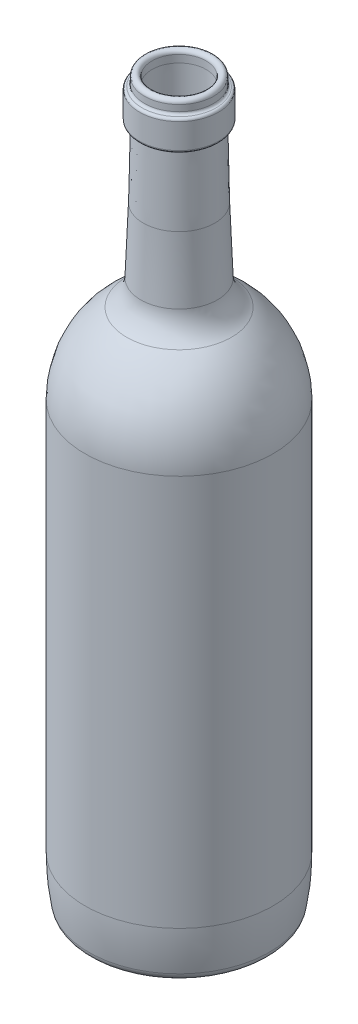
ISO-10303-21;
HEADER;
FILE_DESCRIPTION(('STEP AP214'),'2;1');
FILE_NAME('part.step','',(''),(''),'','','');
FILE_SCHEMA(('AUTOMOTIVE_DESIGN { 1 0 10303 214 1 1 1 1 }'));
ENDSEC;
DATA;
#1=APPLICATION_CONTEXT('core data for automotive mechanical design processes');
#2=APPLICATION_PROTOCOL_DEFINITION('international standard','automotive_design',2000,#1);
#3=PRODUCT_CONTEXT('',#1,'mechanical');
#4=PRODUCT('Part','Part','',(#3));
#5=PRODUCT_RELATED_PRODUCT_CATEGORY('part','',(#4));
#6=PRODUCT_DEFINITION_FORMATION('','',#4);
#7=PRODUCT_DEFINITION_CONTEXT('part definition',#1,'design');
#8=PRODUCT_DEFINITION('design','',#6,#7);
#9=PRODUCT_DEFINITION_SHAPE('','',#8);
#10=(LENGTH_UNIT() NAMED_UNIT(*) SI_UNIT(.MILLI.,.METRE.));
#11=(NAMED_UNIT(*) PLANE_ANGLE_UNIT() SI_UNIT($,.RADIAN.));
#12=(NAMED_UNIT(*) SI_UNIT($,.STERADIAN.) SOLID_ANGLE_UNIT());
#13=UNCERTAINTY_MEASURE_WITH_UNIT(LENGTH_MEASURE(1.E-05),#10,'distance_accuracy_value','');
#14=(GEOMETRIC_REPRESENTATION_CONTEXT(3) GLOBAL_UNCERTAINTY_ASSIGNED_CONTEXT((#13)) GLOBAL_UNIT_ASSIGNED_CONTEXT((#10,
#11,#12)) REPRESENTATION_CONTEXT('',''));
#15=CARTESIAN_POINT('',(0.,0.,0.));
#16=DIRECTION('',(0.,0.,1.));
#17=DIRECTION('',(1.,0.,0.));
#18=AXIS2_PLACEMENT_3D('',#15,#16,#17);
#19=CARTESIAN_POINT('',(0.,-22.,0.));
#20=DIRECTION('',(0.,-1.,0.));
#21=DIRECTION('',(-1.,0.,0.));
#22=AXIS2_PLACEMENT_3D('',#19,#20,#21);
#23=SPHERICAL_SURFACE('',#22,30.);
#24=CARTESIAN_POINT('',(0.,6.77725143150231,0.));
#25=DIRECTION('',(0.,-1.,0.));
#26=DIRECTION('',(0.,0.,-1.));
#27=AXIS2_PLACEMENT_3D('',#24,#25,#26);
#28=CIRCLE('',#27,8.47760579692748);
#29=CARTESIAN_POINT('',(0.,6.77725143150231,-8.47760579692747));
#30=VERTEX_POINT('',#29);
#31=EDGE_CURVE('E10',#30,#30,#28,.T.);
#32=ORIENTED_EDGE('',*,*,#31,.T.);
#33=EDGE_LOOP('',(#32));
#34=FACE_BOUND('',#33,.T.);
#35=ADVANCED_FACE('F30',(#34),#23,.F.);
#36=CARTESIAN_POINT('',(0.,0.163033142466357,0.));
#37=DIRECTION('',(0.,-1.,0.));
#38=DIRECTION('',(0.,0.,-1.));
#39=AXIS2_PLACEMENT_3D('',#36,#37,#38);
#40=CONICAL_SURFACE('',#39,30.9295842547384,1.28430650884736);
#41=CARTESIAN_POINT('',(0.,0.163033142466357,0.));
#42=DIRECTION('',(0.,-1.,0.));
#43=DIRECTION('',(0.,0.,-1.));
#44=AXIS2_PLACEMENT_3D('',#41,#42,#43);
#45=CIRCLE('',#44,30.9295842547384);
#46=CARTESIAN_POINT('',(0.,0.163033142466357,-30.9295842547384));
#47=VERTEX_POINT('',#46);
#48=EDGE_CURVE('E36',#47,#47,#45,.T.);
#49=CARTESIAN_POINT('',(0.,6.77725143150231,-8.47760579692747));
#50=CARTESIAN_POINT('',(0.,6.70835332432485,-8.71148057252967));
#51=CARTESIAN_POINT('',(0.,6.6394552171474,-8.94535534813187));
#52=CARTESIAN_POINT('',(0.,6.50165900279248,-9.41310489933626));
#53=CARTESIAN_POINT('',(0.,6.43276089561502,-9.64697967493846));
#54=CARTESIAN_POINT('',(0.,6.29496468126011,-10.1147292261429));
#55=CARTESIAN_POINT('',(0.,6.22606657408265,-10.348604001745));
#56=CARTESIAN_POINT('',(0.,6.08827035972773,-10.8163535529494));
#57=CARTESIAN_POINT('',(0.,6.01937225255028,-11.0502283285516));
#58=CARTESIAN_POINT('',(0.,5.88157603819536,-11.517977879756));
#59=CARTESIAN_POINT('',(0.,5.8126779310179,-11.7518526553582));
#60=CARTESIAN_POINT('',(0.,5.67488171666299,-12.2196022065626));
#61=CARTESIAN_POINT('',(0.,5.60598360948553,-12.4534769821648));
#62=CARTESIAN_POINT('',(0.,5.46818739513061,-12.9212265333692));
#63=CARTESIAN_POINT('',(0.,5.39928928795315,-13.1551013089714));
#64=CARTESIAN_POINT('',(0.,5.26149307359824,-13.6228508601758));
#65=CARTESIAN_POINT('',(0.,5.19259496642078,-13.856725635778));
#66=CARTESIAN_POINT('',(0.,5.05479875206587,-14.3244751869824));
#67=CARTESIAN_POINT('',(0.,4.98590064488841,-14.5583499625846));
#68=CARTESIAN_POINT('',(0.,4.84810443053349,-15.026099513789));
#69=CARTESIAN_POINT('',(0.,4.77920632335603,-15.2599742893912));
#70=CARTESIAN_POINT('',(0.,4.64141010900112,-15.7277238405956));
#71=CARTESIAN_POINT('',(0.,4.57251200182366,-15.9615986161978));
#72=CARTESIAN_POINT('',(0.,4.43471578746875,-16.4293481674022));
#73=CARTESIAN_POINT('',(0.,4.36581768029129,-16.6632229430044));
#74=CARTESIAN_POINT('',(0.,4.22802146593637,-17.1309724942088));
#75=CARTESIAN_POINT('',(0.,4.15912335875891,-17.364847269811));
#76=CARTESIAN_POINT('',(0.,4.021327144404,-17.8325968210153));
#77=CARTESIAN_POINT('',(0.,3.95242903722654,-18.0664715966175));
#78=CARTESIAN_POINT('',(0.,3.81463282287162,-18.5342211478219));
#79=CARTESIAN_POINT('',(0.,3.74573471569417,-18.7680959234241));
#80=CARTESIAN_POINT('',(0.,3.60793850133925,-19.2358454746285));
#81=CARTESIAN_POINT('',(0.,3.53904039416179,-19.4697202502307));
#82=CARTESIAN_POINT('',(0.,3.40124417980688,-19.9374698014351));
#83=CARTESIAN_POINT('',(0.,3.33234607262942,-20.1713445770373));
#84=CARTESIAN_POINT('',(0.,3.1945498582745,-20.6390941282417));
#85=CARTESIAN_POINT('',(0.,3.12565175109705,-20.8729689038439));
#86=CARTESIAN_POINT('',(0.,2.98785553674213,-21.3407184550483));
#87=CARTESIAN_POINT('',(0.,2.91895742956467,-21.5745932306505));
#88=CARTESIAN_POINT('',(0.,2.78116121520976,-22.0423427818549));
#89=CARTESIAN_POINT('',(0.,2.7122631080323,-22.2762175574571));
#90=CARTESIAN_POINT('',(0.,2.57446689367738,-22.7439671086615));
#91=CARTESIAN_POINT('',(0.,2.50556878649992,-22.9778418842637));
#92=CARTESIAN_POINT('',(0.,2.36777257214501,-23.4455914354681));
#93=CARTESIAN_POINT('',(0.,2.29887446496755,-23.6794662110703));
#94=CARTESIAN_POINT('',(0.,2.16107825061263,-24.1472157622747));
#95=CARTESIAN_POINT('',(0.,2.09218014343518,-24.3810905378769));
#96=CARTESIAN_POINT('',(0.,1.95438392908026,-24.8488400890812));
#97=CARTESIAN_POINT('',(0.,1.8854858219028,-25.0827148646834));
#98=CARTESIAN_POINT('',(0.,1.74768960754789,-25.5504644158878));
#99=CARTESIAN_POINT('',(0.,1.67879150037043,-25.78433919149));
#100=CARTESIAN_POINT('',(0.,1.54099528601551,-26.2520887426944));
#101=CARTESIAN_POINT('',(0.,1.47209717883806,-26.4859635182966));
#102=CARTESIAN_POINT('',(0.,1.33430096448314,-26.953713069501));
#103=CARTESIAN_POINT('',(0.,1.26540285730568,-27.1875878451032));
#104=CARTESIAN_POINT('',(0.,1.12760664295077,-27.6553373963076));
#105=CARTESIAN_POINT('',(0.,1.05870853577331,-27.8892121719098));
#106=CARTESIAN_POINT('',(0.,0.920912321418394,-28.3569617231142));
#107=CARTESIAN_POINT('',(0.,0.852014214240936,-28.5908364987164));
#108=CARTESIAN_POINT('',(0.,0.71421799988602,-29.0585860499208));
#109=CARTESIAN_POINT('',(0.,0.645319892708562,-29.292460825523));
#110=CARTESIAN_POINT('',(0.,0.507523678353646,-29.7602103767274));
#111=CARTESIAN_POINT('',(0.,0.438625571176189,-29.9940851523296));
#112=CARTESIAN_POINT('',(0.,0.300829356821273,-30.461834703534));
#113=CARTESIAN_POINT('',(0.,0.231931249643816,-30.6957094791362));
#114=CARTESIAN_POINT('',(0.,0.163033142466357,-30.9295842547384));
#115=B_SPLINE_CURVE_WITH_KNOTS('',3,(#49,#50,#51,#52,#53,#54,#55,#56,#57,#58,#59,#60,#61,#62,
#63,#64,#65,#66,#67,#68,#69,#70,#71,#72,#73,#74,#75,#76,#77,#78,#79,#80,#81,#82,#83,#84,#85,#86,
#87,#88,#89,#90,#91,#92,#93,#94,#95,#96,#97,#98,#99,#100,#101,#102,#103,#104,#105,#106,#107,
#108,#109,#110,#111,#112,#113,#114),.UNSPECIFIED.,.F.,.F.,(4,2,2,2,2,2,2,2,2,2,2,2,2,2,2,2,2,2,
2,2,2,2,2,2,2,2,2,2,2,2,2,2,4),(0.,0.731436421379558,1.46287284275911,2.19430926413866,
2.92574568551822,3.65718210689777,4.38861852827733,5.12005494965688,5.85149137103643,
6.58292779241599,7.31436421379554,8.0458006351751,8.77723705655465,9.50867347793421,
10.2401098993138,10.9715463206933,11.7029827420729,12.4344191634524,13.165855584832,
13.8972920062115,14.6287284275911,15.3601648489706,16.0916012703502,16.8230376917298,
17.5544741131093,18.2859105344889,19.0173469558684,19.748783377248,20.4802197986275,
21.2116562200071,21.9430926413866,22.6745290627662,23.4059654841457),.UNSPECIFIED.);
#116=EDGE_CURVE('BSEAM128',#30,#47,#115,.T.);
#117=ORIENTED_EDGE('',*,*,#31,.F.);
#118=ORIENTED_EDGE('',*,*,#48,.T.);
#119=ORIENTED_EDGE('',*,*,#116,.T.);
#120=ORIENTED_EDGE('',*,*,#116,.F.);
#121=EDGE_LOOP('',(#117,#119,#118,#120));
#122=FACE_BOUND('',#121,.T.);
#123=ADVANCED_FACE('F128',(#122),#40,.F.);
#124=CARTESIAN_POINT('',(0.,4.,0.));
#125=DIRECTION('',(0.,-1.,0.));
#126=DIRECTION('',(0.,0.,-1.));
#127=AXIS2_PLACEMENT_3D('',#124,#125,#126);
#128=TOROIDAL_SURFACE('',#127,32.0599316943287,4.);
#129=ORIENTED_EDGE('',*,*,#48,.F.);
#130=EDGE_LOOP('',(#129));
#131=FACE_BOUND('',#130,.T.);
#132=CARTESIAN_POINT('',(0.,3.31017266896382,0.));
#133=DIRECTION('',(0.,-1.,0.));
#134=DIRECTION('',(0.,0.,-1.));
#135=AXIS2_PLACEMENT_3D('',#132,#133,#134);
#136=CIRCLE('',#135,36.);
#137=CARTESIAN_POINT('',(0.,3.31017266896382,-36.));
#138=VERTEX_POINT('',#137);
#139=EDGE_CURVE('E40',#138,#138,#136,.T.);
#140=ORIENTED_EDGE('',*,*,#139,.T.);
#141=EDGE_LOOP('',(#140));
#142=FACE_BOUND('',#141,.T.);
#143=ADVANCED_FACE('F132',(#131,#142),#128,.T.);
#144=CARTESIAN_POINT('',(0.,20.,0.));
#145=DIRECTION('',(0.,-1.,0.));
#146=DIRECTION('',(0.,0.,-1.));
#147=AXIS2_PLACEMENT_3D('',#144,#145,#146);
#148=DEGENERATE_TOROIDAL_SURFACE('',#147,59.3268401171732,96.7768401171732,.F.);
#149=ORIENTED_EDGE('',*,*,#139,.F.);
#150=EDGE_LOOP('',(#149));
#151=FACE_BOUND('',#150,.T.);
#152=CARTESIAN_POINT('',(0.,20.,0.));
#153=DIRECTION('',(0.,-1.,0.));
#154=DIRECTION('',(0.,0.,-1.));
#155=AXIS2_PLACEMENT_3D('',#152,#153,#154);
#156=CIRCLE('',#155,37.45);
#157=CARTESIAN_POINT('',(0.,20.,-37.45));
#158=VERTEX_POINT('',#157);
#159=EDGE_CURVE('E44',#158,#158,#156,.T.);
#160=ORIENTED_EDGE('',*,*,#159,.T.);
#161=EDGE_LOOP('',(#160));
#162=FACE_BOUND('',#161,.T.);
#163=ADVANCED_FACE('F137',(#151,#162),#148,.F.);
#164=CARTESIAN_POINT('',(0.,0.,0.));
#165=DIRECTION('',(0.,-1.,0.));
#166=DIRECTION('',(0.,0.,-1.));
#167=AXIS2_PLACEMENT_3D('',#164,#165,#166);
#168=CYLINDRICAL_SURFACE('',#167,37.45);
#169=ORIENTED_EDGE('',*,*,#159,.F.);
#170=EDGE_LOOP('',(#169));
#171=FACE_BOUND('',#170,.T.);
#172=CARTESIAN_POINT('',(0.,176.,0.));
#173=DIRECTION('',(0.,-1.,0.));
#174=DIRECTION('',(0.,0.,-1.));
#175=AXIS2_PLACEMENT_3D('',#172,#173,#174);
#176=CIRCLE('',#175,37.45);
#177=CARTESIAN_POINT('',(0.,176.,-37.45));
#178=VERTEX_POINT('',#177);
#179=EDGE_CURVE('E49',#178,#178,#176,.T.);
#180=ORIENTED_EDGE('',*,*,#179,.T.);
#181=EDGE_LOOP('',(#180));
#182=FACE_BOUND('',#181,.T.);
#183=ADVANCED_FACE('F143',(#171,#182),#168,.T.);
#184=CARTESIAN_POINT('',(0.,176.,0.));
#185=DIRECTION('',(0.,-1.,0.));
#186=DIRECTION('',(0.,0.,-1.));
#187=AXIS2_PLACEMENT_3D('',#184,#185,#186);
#188=DEGENERATE_TOROIDAL_SURFACE('',#187,1.55,39.,.F.);
#189=ORIENTED_EDGE('',*,*,#179,.F.);
#190=EDGE_LOOP('',(#189));
#191=FACE_BOUND('',#190,.T.);
#192=CARTESIAN_POINT('',(0.,207.910311998831,0.));
#193=DIRECTION('',(0.,-1.,0.));
#194=DIRECTION('',(0.,0.,-1.));
#195=AXIS2_PLACEMENT_3D('',#192,#193,#194);
#196=CIRCLE('',#195,20.8716856667212);
#197=CARTESIAN_POINT('',(0.,207.910311998831,-20.8716856667212));
#198=VERTEX_POINT('',#197);
#199=EDGE_CURVE('E52',#198,#198,#196,.T.);
#200=ORIENTED_EDGE('',*,*,#199,.T.);
#201=EDGE_LOOP('',(#200));
#202=FACE_BOUND('',#201,.T.);
#203=ADVANCED_FACE('F147',(#191,#202),#188,.F.);
#204=CARTESIAN_POINT('',(0.,218.774583303086,0.));
#205=DIRECTION('',(0.,-1.,0.));
#206=DIRECTION('',(0.,0.,-1.));
#207=AXIS2_PLACEMENT_3D('',#204,#205,#206);
#208=TOROIDAL_SURFACE('',#207,28.5054335345272,13.2780456951197);
#209=ORIENTED_EDGE('',*,*,#199,.F.);
#210=EDGE_LOOP('',(#209));
#211=FACE_BOUND('',#210,.T.);
#212=CARTESIAN_POINT('',(0.,218.,0.));
#213=DIRECTION('',(0.,-1.,0.));
#214=DIRECTION('',(0.,0.,-1.));
#215=AXIS2_PLACEMENT_3D('',#212,#213,#214);
#216=CIRCLE('',#215,15.25);
#217=CARTESIAN_POINT('',(0.,218.,-15.25));
#218=VERTEX_POINT('',#217);
#219=EDGE_CURVE('E55',#218,#218,#216,.T.);
#220=ORIENTED_EDGE('',*,*,#219,.T.);
#221=EDGE_LOOP('',(#220));
#222=FACE_BOUND('',#221,.T.);
#223=ADVANCED_FACE('F151',(#211,#222),#208,.F.);
#224=CARTESIAN_POINT('',(0.,256.089285714286,0.));
#225=DIRECTION('',(0.,-1.,0.));
#226=DIRECTION('',(0.,0.,-1.));
#227=AXIS2_PLACEMENT_3D('',#224,#225,#226);
#228=TOROIDAL_SURFACE('',#227,667.07142857143,652.933356806899);
#229=ORIENTED_EDGE('',*,*,#219,.F.);
#230=EDGE_LOOP('',(#229));
#231=FACE_BOUND('',#230,.T.);
#232=CARTESIAN_POINT('',(0.,244.,0.));
#233=DIRECTION('',(0.,-1.,0.));
#234=DIRECTION('',(0.,0.,-1.));
#235=AXIS2_PLACEMENT_3D('',#232,#233,#234);
#236=CIRCLE('',#235,14.25);
#237=CARTESIAN_POINT('',(0.,244.,-14.25));
#238=VERTEX_POINT('',#237);
#239=EDGE_CURVE('E58',#238,#238,#236,.T.);
#240=ORIENTED_EDGE('',*,*,#239,.T.);
#241=EDGE_LOOP('',(#240));
#242=FACE_BOUND('',#241,.T.);
#243=ADVANCED_FACE('F155',(#231,#242),#228,.F.);
#244=CARTESIAN_POINT('',(0.,271.,0.));
#245=DIRECTION('',(0.,-1.,0.));
#246=DIRECTION('',(0.,0.,-1.));
#247=AXIS2_PLACEMENT_3D('',#244,#245,#246);
#248=CONICAL_SURFACE('',#247,13.75,0.0185164020680084);
#249=ORIENTED_EDGE('',*,*,#239,.F.);
#250=EDGE_LOOP('',(#249));
#251=FACE_BOUND('',#250,.T.);
#252=CARTESIAN_POINT('',(0.,271.,0.));
#253=DIRECTION('',(0.,-1.,0.));
#254=DIRECTION('',(0.,0.,-1.));
#255=AXIS2_PLACEMENT_3D('',#252,#253,#254);
#256=CIRCLE('',#255,13.75);
#257=CARTESIAN_POINT('',(0.,271.,-13.75));
#258=VERTEX_POINT('',#257);
#259=EDGE_CURVE('E61',#258,#258,#256,.T.);
#260=ORIENTED_EDGE('',*,*,#259,.T.);
#261=EDGE_LOOP('',(#260));
#262=FACE_BOUND('',#261,.T.);
#263=ADVANCED_FACE('F159',(#251,#262),#248,.T.);
#264=CARTESIAN_POINT('',(0.,271.018515344006,0.));
#265=DIRECTION('',(0.,-1.,0.));
#266=DIRECTION('',(0.,0.,-1.));
#267=AXIS2_PLACEMENT_3D('',#264,#265,#266);
#268=TOROIDAL_SURFACE('',#267,14.7498285763251,1.00000000000001);
#269=ORIENTED_EDGE('',*,*,#259,.F.);
#270=EDGE_LOOP('',(#269));
#271=FACE_BOUND('',#270,.T.);
#272=CARTESIAN_POINT('',(0.,272.018515329313,0.));
#273=DIRECTION('',(0.,-1.,0.));
#274=DIRECTION('',(0.,0.,-1.));
#275=AXIS2_PLACEMENT_3D('',#272,#273,#274);
#276=CIRCLE('',#275,14.75);
#277=CARTESIAN_POINT('',(0.,272.018515329313,-14.75));
#278=VERTEX_POINT('',#277);
#279=EDGE_CURVE('E64',#278,#278,#276,.T.);
#280=ORIENTED_EDGE('',*,*,#279,.T.);
#281=EDGE_LOOP('',(#280));
#282=FACE_BOUND('',#281,.T.);
#283=ADVANCED_FACE('F163',(#271,#282),#268,.F.);
#284=CARTESIAN_POINT('',(0.,273.018343920329,0.));
#285=DIRECTION('',(0.,-1.,0.));
#286=DIRECTION('',(0.,0.,-1.));
#287=AXIS2_PLACEMENT_3D('',#284,#285,#286);
#288=TOROIDAL_SURFACE('',#287,14.7501713942938,0.999828605706198);
#289=ORIENTED_EDGE('',*,*,#279,.F.);
#290=EDGE_LOOP('',(#289));
#291=FACE_BOUND('',#290,.T.);
#292=CARTESIAN_POINT('',(0.,273.018343920329,0.));
#293=DIRECTION('',(0.,-1.,0.));
#294=DIRECTION('',(0.,0.,-1.));
#295=AXIS2_PLACEMENT_3D('',#292,#293,#294);
#296=CIRCLE('',#295,15.75);
#297=CARTESIAN_POINT('',(0.,273.018343920329,-15.75));
#298=VERTEX_POINT('',#297);
#299=EDGE_CURVE('E67',#298,#298,#296,.T.);
#300=ORIENTED_EDGE('',*,*,#299,.T.);
#301=EDGE_LOOP('',(#300));
#302=FACE_BOUND('',#301,.T.);
#303=ADVANCED_FACE('F167',(#291,#302),#288,.T.);
#304=CARTESIAN_POINT('',(0.,0.,0.));
#305=DIRECTION('',(0.,-1.,0.));
#306=DIRECTION('',(0.,0.,-1.));
#307=AXIS2_PLACEMENT_3D('',#304,#305,#306);
#308=CYLINDRICAL_SURFACE('',#307,15.75);
#309=ORIENTED_EDGE('',*,*,#299,.F.);
#310=EDGE_LOOP('',(#309));
#311=FACE_BOUND('',#310,.T.);
#312=CARTESIAN_POINT('',(0.,283.018343920329,0.));
#313=DIRECTION('',(0.,-1.,0.));
#314=DIRECTION('',(0.,0.,-1.));
#315=AXIS2_PLACEMENT_3D('',#312,#313,#314);
#316=CIRCLE('',#315,15.75);
#317=CARTESIAN_POINT('',(0.,283.018343920329,-15.75));
#318=VERTEX_POINT('',#317);
#319=EDGE_CURVE('E70',#318,#318,#316,.T.);
#320=ORIENTED_EDGE('',*,*,#319,.T.);
#321=EDGE_LOOP('',(#320));
#322=FACE_BOUND('',#321,.T.);
#323=ADVANCED_FACE('F171',(#311,#322),#308,.T.);
#324=CARTESIAN_POINT('',(0.,283.018343920329,0.));
#325=DIRECTION('',(0.,-1.,0.));
#326=DIRECTION('',(0.,0.,-1.));
#327=AXIS2_PLACEMENT_3D('',#324,#325,#326);
#328=TOROIDAL_SURFACE('',#327,14.75,1.);
#329=ORIENTED_EDGE('',*,*,#319,.F.);
#330=EDGE_LOOP('',(#329));
#331=FACE_BOUND('',#330,.T.);
#332=CARTESIAN_POINT('',(0.,284.018343920329,0.));
#333=DIRECTION('',(0.,-1.,0.));
#334=DIRECTION('',(0.,0.,-1.));
#335=AXIS2_PLACEMENT_3D('',#332,#333,#334);
#336=CIRCLE('',#335,14.75);
#337=CARTESIAN_POINT('',(0.,284.018343920329,-14.75));
#338=VERTEX_POINT('',#337);
#339=EDGE_CURVE('E73',#338,#338,#336,.T.);
#340=ORIENTED_EDGE('',*,*,#339,.T.);
#341=EDGE_LOOP('',(#340));
#342=FACE_BOUND('',#341,.T.);
#343=ADVANCED_FACE('F175',(#331,#342),#328,.T.);
#344=CARTESIAN_POINT('',(0.,285.018343920329,0.));
#345=DIRECTION('',(0.,-1.,0.));
#346=DIRECTION('',(0.,0.,-1.));
#347=AXIS2_PLACEMENT_3D('',#344,#345,#346);
#348=TOROIDAL_SURFACE('',#347,14.75,1.);
#349=ORIENTED_EDGE('',*,*,#339,.F.);
#350=EDGE_LOOP('',(#349));
#351=FACE_BOUND('',#350,.T.);
#352=CARTESIAN_POINT('',(0.,285.018343920329,0.));
#353=DIRECTION('',(0.,-1.,0.));
#354=DIRECTION('',(0.,0.,-1.));
#355=AXIS2_PLACEMENT_3D('',#352,#353,#354);
#356=CIRCLE('',#355,13.75);
#357=CARTESIAN_POINT('',(0.,285.018343920329,-13.75));
#358=VERTEX_POINT('',#357);
#359=EDGE_CURVE('E76',#358,#358,#356,.T.);
#360=ORIENTED_EDGE('',*,*,#359,.T.);
#361=EDGE_LOOP('',(#360));
#362=FACE_BOUND('',#361,.T.);
#363=ADVANCED_FACE('F179',(#351,#362),#348,.F.);
#364=CARTESIAN_POINT('',(0.,0.,0.));
#365=DIRECTION('',(0.,-1.,0.));
#366=DIRECTION('',(0.,0.,-1.));
#367=AXIS2_PLACEMENT_3D('',#364,#365,#366);
#368=CYLINDRICAL_SURFACE('',#367,13.75);
#369=ORIENTED_EDGE('',*,*,#359,.F.);
#370=EDGE_LOOP('',(#369));
#371=FACE_BOUND('',#370,.T.);
#372=CARTESIAN_POINT('',(0.,287.5,0.));
#373=DIRECTION('',(0.,-1.,0.));
#374=DIRECTION('',(0.,0.,-1.));
#375=AXIS2_PLACEMENT_3D('',#372,#373,#374);
#376=CIRCLE('',#375,13.75);
#377=CARTESIAN_POINT('',(0.,287.5,-13.75));
#378=VERTEX_POINT('',#377);
#379=EDGE_CURVE('E79',#378,#378,#376,.T.);
#380=ORIENTED_EDGE('',*,*,#379,.T.);
#381=EDGE_LOOP('',(#380));
#382=FACE_BOUND('',#381,.T.);
#383=ADVANCED_FACE('F183',(#371,#382),#368,.T.);
#384=CARTESIAN_POINT('',(0.,287.5,0.));
#385=DIRECTION('',(0.,-1.,0.));
#386=DIRECTION('',(0.,0.,-1.));
#387=AXIS2_PLACEMENT_3D('',#384,#385,#386);
#388=TOROIDAL_SURFACE('',#387,12.25,1.5);
#389=ORIENTED_EDGE('',*,*,#379,.F.);
#390=EDGE_LOOP('',(#389));
#391=FACE_BOUND('',#390,.T.);
#392=CARTESIAN_POINT('',(0.,287.5,0.));
#393=DIRECTION('',(0.,-1.,0.));
#394=DIRECTION('',(0.,0.,-1.));
#395=AXIS2_PLACEMENT_3D('',#392,#393,#394);
#396=CIRCLE('',#395,10.75);
#397=CARTESIAN_POINT('',(0.,287.5,-10.75));
#398=VERTEX_POINT('',#397);
#399=EDGE_CURVE('E82',#398,#398,#396,.T.);
#400=ORIENTED_EDGE('',*,*,#399,.T.);
#401=EDGE_LOOP('',(#400));
#402=FACE_BOUND('',#401,.T.);
#403=ADVANCED_FACE('F187',(#391,#402),#388,.T.);
#404=CARTESIAN_POINT('',(0.,284.500189315799,0.));
#405=DIRECTION('',(0.,-1.,0.));
#406=DIRECTION('',(0.,0.,-1.));
#407=AXIS2_PLACEMENT_3D('',#404,#405,#406);
#408=CONICAL_SURFACE('',#407,10.7837025066437,0.0112344051989248);
#409=ORIENTED_EDGE('',*,*,#399,.F.);
#410=EDGE_LOOP('',(#409));
#411=FACE_BOUND('',#410,.T.);
#412=CARTESIAN_POINT('',(0.,284.500189315799,0.));
#413=DIRECTION('',(0.,-1.,0.));
#414=DIRECTION('',(0.,0.,-1.));
#415=AXIS2_PLACEMENT_3D('',#412,#413,#414);
#416=CIRCLE('',#415,10.7837025066437);
#417=CARTESIAN_POINT('',(0.,284.500189315799,-10.7837025066437));
#418=VERTEX_POINT('',#417);
#419=EDGE_CURVE('E85',#418,#418,#416,.T.);
#420=ORIENTED_EDGE('',*,*,#419,.T.);
#421=EDGE_LOOP('',(#420));
#422=FACE_BOUND('',#421,.T.);
#423=ADVANCED_FACE('F191',(#411,#422),#408,.F.);
#424=CARTESIAN_POINT('',(0.,270.944453967982,0.));
#425=DIRECTION('',(0.,1.,0.));
#426=DIRECTION('',(0.,0.,1.));
#427=AXIS2_PLACEMENT_3D('',#424,#425,#426);
#428=CONICAL_SURFACE('',#427,10.7505142710246,0.00244827509956609);
#429=ORIENTED_EDGE('',*,*,#419,.F.);
#430=EDGE_LOOP('',(#429));
#431=FACE_BOUND('',#430,.T.);
#432=CARTESIAN_POINT('',(0.,270.944453967982,0.));
#433=DIRECTION('',(0.,-1.,0.));
#434=DIRECTION('',(0.,0.,-1.));
#435=AXIS2_PLACEMENT_3D('',#432,#433,#434);
#436=CIRCLE('',#435,10.7505142710246);
#437=CARTESIAN_POINT('',(0.,270.944453967982,-10.7505142710246));
#438=VERTEX_POINT('',#437);
#439=EDGE_CURVE('E88',#438,#438,#436,.T.);
#440=ORIENTED_EDGE('',*,*,#439,.T.);
#441=EDGE_LOOP('',(#440));
#442=FACE_BOUND('',#441,.T.);
#443=ADVANCED_FACE('F195',(#431,#442),#428,.F.);
#444=CARTESIAN_POINT('',(0.,243.944453967982,0.));
#445=DIRECTION('',(0.,-1.,0.));
#446=DIRECTION('',(0.,0.,-1.));
#447=AXIS2_PLACEMENT_3D('',#444,#445,#446);
#448=CONICAL_SURFACE('',#447,11.2505142710247,0.0185164020680142);
#449=ORIENTED_EDGE('',*,*,#439,.F.);
#450=EDGE_LOOP('',(#449));
#451=FACE_BOUND('',#450,.T.);
#452=CARTESIAN_POINT('',(0.,243.944453967982,0.));
#453=DIRECTION('',(0.,-1.,0.));
#454=DIRECTION('',(0.,0.,-1.));
#455=AXIS2_PLACEMENT_3D('',#452,#453,#454);
#456=CIRCLE('',#455,11.2505142710247);
#457=CARTESIAN_POINT('',(0.,243.944453967982,-11.2505142710247));
#458=VERTEX_POINT('',#457);
#459=EDGE_CURVE('E91',#458,#458,#456,.T.);
#460=ORIENTED_EDGE('',*,*,#459,.T.);
#461=EDGE_LOOP('',(#460));
#462=FACE_BOUND('',#461,.T.);
#463=ADVANCED_FACE('F199',(#451,#462),#448,.F.);
#464=CARTESIAN_POINT('',(0.,256.089285714286,0.));
#465=DIRECTION('',(0.,-1.,0.));
#466=DIRECTION('',(0.,0.,-1.));
#467=AXIS2_PLACEMENT_3D('',#464,#465,#466);
#468=TOROIDAL_SURFACE('',#467,667.07142857143,655.933356806899);
#469=ORIENTED_EDGE('',*,*,#459,.F.);
#470=EDGE_LOOP('',(#469));
#471=FACE_BOUND('',#470,.T.);
#472=CARTESIAN_POINT('',(0.,217.824993077852,0.));
#473=DIRECTION('',(0.,-1.,0.));
#474=DIRECTION('',(0.,0.,-1.));
#475=AXIS2_PLACEMENT_3D('',#472,#473,#474);
#476=CIRCLE('',#475,12.2551089206451);
#477=CARTESIAN_POINT('',(0.,217.824993077852,-12.2551089206451));
#478=VERTEX_POINT('',#477);
#479=EDGE_CURVE('E94',#478,#478,#476,.T.);
#480=ORIENTED_EDGE('',*,*,#479,.T.);
#481=EDGE_LOOP('',(#480));
#482=FACE_BOUND('',#481,.T.);
#483=ADVANCED_FACE('F203',(#471,#482),#468,.T.);
#484=CARTESIAN_POINT('',(0.,218.774583303086,0.));
#485=DIRECTION('',(0.,-1.,0.));
#486=DIRECTION('',(0.,0.,-1.));
#487=AXIS2_PLACEMENT_3D('',#484,#485,#486);
#488=TOROIDAL_SURFACE('',#487,28.5054335345272,16.2780456951196);
#489=ORIENTED_EDGE('',*,*,#479,.F.);
#490=EDGE_LOOP('',(#489));
#491=FACE_BOUND('',#490,.T.);
#492=CARTESIAN_POINT('',(0.,205.455672614306,0.));
#493=DIRECTION('',(0.,-1.,0.));
#494=DIRECTION('',(0.,0.,-1.));
#495=AXIS2_PLACEMENT_3D('',#492,#493,#494);
#496=CIRCLE('',#495,19.146940615435);
#497=CARTESIAN_POINT('',(0.,205.455672614306,-19.146940615435));
#498=VERTEX_POINT('',#497);
#499=EDGE_CURVE('E97',#498,#498,#496,.T.);
#500=ORIENTED_EDGE('',*,*,#499,.T.);
#501=EDGE_LOOP('',(#500));
#502=FACE_BOUND('',#501,.T.);
#503=ADVANCED_FACE('F207',(#491,#502),#488,.T.);
#504=CARTESIAN_POINT('',(0.,176.,0.));
#505=DIRECTION('',(0.,-1.,0.));
#506=DIRECTION('',(0.,0.,-1.));
#507=AXIS2_PLACEMENT_3D('',#504,#505,#506);
#508=DEGENERATE_TOROIDAL_SURFACE('',#507,1.55,36.,.F.);
#509=ORIENTED_EDGE('',*,*,#499,.F.);
#510=EDGE_LOOP('',(#509));
#511=FACE_BOUND('',#510,.T.);
#512=CARTESIAN_POINT('',(0.,176.,0.));
#513=DIRECTION('',(0.,-1.,0.));
#514=DIRECTION('',(0.,0.,-1.));
#515=AXIS2_PLACEMENT_3D('',#512,#513,#514);
#516=CIRCLE('',#515,34.45);
#517=CARTESIAN_POINT('',(0.,176.,-34.45));
#518=VERTEX_POINT('',#517);
#519=EDGE_CURVE('E100',#518,#518,#516,.T.);
#520=ORIENTED_EDGE('',*,*,#519,.T.);
#521=EDGE_LOOP('',(#520));
#522=FACE_BOUND('',#521,.T.);
#523=ADVANCED_FACE('F211',(#511,#522),#508,.T.);
#524=CARTESIAN_POINT('',(0.,0.,0.));
#525=DIRECTION('',(0.,-1.,0.));
#526=DIRECTION('',(0.,0.,-1.));
#527=AXIS2_PLACEMENT_3D('',#524,#525,#526);
#528=CYLINDRICAL_SURFACE('',#527,34.45);
#529=ORIENTED_EDGE('',*,*,#519,.F.);
#530=EDGE_LOOP('',(#529));
#531=FACE_BOUND('',#530,.T.);
#532=CARTESIAN_POINT('',(0.,20.,0.));
#533=DIRECTION('',(0.,-1.,0.));
#534=DIRECTION('',(0.,0.,-1.));
#535=AXIS2_PLACEMENT_3D('',#532,#533,#534);
#536=CIRCLE('',#535,34.45);
#537=CARTESIAN_POINT('',(0.,20.,-34.45));
#538=VERTEX_POINT('',#537);
#539=EDGE_CURVE('E103',#538,#538,#536,.T.);
#540=ORIENTED_EDGE('',*,*,#539,.T.);
#541=EDGE_LOOP('',(#540));
#542=FACE_BOUND('',#541,.T.);
#543=ADVANCED_FACE('F215',(#531,#542),#528,.F.);
#544=CARTESIAN_POINT('',(0.,20.,0.));
#545=DIRECTION('',(0.,-1.,0.));
#546=DIRECTION('',(0.,0.,-1.));
#547=AXIS2_PLACEMENT_3D('',#544,#545,#546);
#548=DEGENERATE_TOROIDAL_SURFACE('',#547,59.3268401171732,93.7768401171732,.F.);
#549=ORIENTED_EDGE('',*,*,#539,.F.);
#550=EDGE_LOOP('',(#549));
#551=FACE_BOUND('',#550,.T.);
#552=CARTESIAN_POINT('',(0.,3.82754316724098,0.));
#553=DIRECTION('',(0.,-1.,0.));
#554=DIRECTION('',(0.,0.,-1.));
#555=AXIS2_PLACEMENT_3D('',#552,#553,#554);
#556=CIRCLE('',#555,33.0449487707465);
#557=CARTESIAN_POINT('',(0.,3.82754316724098,-33.0449487707465));
#558=VERTEX_POINT('',#557);
#559=EDGE_CURVE('E106',#558,#558,#556,.T.);
#560=ORIENTED_EDGE('',*,*,#559,.T.);
#561=EDGE_LOOP('',(#560));
#562=FACE_BOUND('',#561,.T.);
#563=ADVANCED_FACE('F219',(#551,#562),#548,.T.);
#564=CARTESIAN_POINT('',(0.,4.,0.));
#565=DIRECTION('',(0.,-1.,0.));
#566=DIRECTION('',(0.,0.,-1.));
#567=AXIS2_PLACEMENT_3D('',#564,#565,#566);
#568=TOROIDAL_SURFACE('',#567,32.0599316943287,1.);
#569=ORIENTED_EDGE('',*,*,#559,.F.);
#570=EDGE_LOOP('',(#569));
#571=FACE_BOUND('',#570,.T.);
#572=CARTESIAN_POINT('',(0.,3.04075828561659,0.));
#573=DIRECTION('',(0.,-1.,0.));
#574=DIRECTION('',(0.,0.,-1.));
#575=AXIS2_PLACEMENT_3D('',#572,#573,#574);
#576=CIRCLE('',#575,31.7773448344311);
#577=CARTESIAN_POINT('',(0.,3.04075828561659,-31.7773448344311));
#578=VERTEX_POINT('',#577);
#579=EDGE_CURVE('E109',#578,#578,#576,.T.);
#580=ORIENTED_EDGE('',*,*,#579,.T.);
#581=EDGE_LOOP('',(#580));
#582=FACE_BOUND('',#581,.T.);
#583=ADVANCED_FACE('F124',(#571,#582),#568,.F.);
#584=CARTESIAN_POINT('',(0.,9.65497657465254,0.));
#585=DIRECTION('',(0.,-1.,0.));
#586=DIRECTION('',(0.,0.,-1.));
#587=AXIS2_PLACEMENT_3D('',#584,#585,#586);
#588=CONICAL_SURFACE('',#587,9.32536637662023,1.28430650884736);
#589=CARTESIAN_POINT('',(0.,9.65497657465254,0.));
#590=DIRECTION('',(0.,-1.,0.));
#591=DIRECTION('',(0.,0.,-1.));
#592=AXIS2_PLACEMENT_3D('',#589,#590,#591);
#593=CIRCLE('',#592,9.32536637662023);
#594=CARTESIAN_POINT('',(0.,9.65497657465254,-9.32536637662022));
#595=VERTEX_POINT('',#594);
#596=EDGE_CURVE('E112',#595,#595,#593,.T.);
#597=CARTESIAN_POINT('',(0.,3.04075828561659,-31.7773448344311));
#598=CARTESIAN_POINT('',(0.,3.10965639279404,-31.5434700588289));
#599=CARTESIAN_POINT('',(0.,3.1785544999715,-31.3095952832267));
#600=CARTESIAN_POINT('',(0.,3.31635071432642,-30.8418457320223));
#601=CARTESIAN_POINT('',(0.,3.38524882150387,-30.6079709564201));
#602=CARTESIAN_POINT('',(0.,3.52304503585879,-30.1402214052157));
#603=CARTESIAN_POINT('',(0.,3.59194314303625,-29.9063466296135));
#604=CARTESIAN_POINT('',(0.,3.72973935739116,-29.4385970784091));
#605=CARTESIAN_POINT('',(0.,3.79863746456862,-29.204722302807));
#606=CARTESIAN_POINT('',(0.,3.93643367892354,-28.7369727516026));
#607=CARTESIAN_POINT('',(0.,4.00533178610099,-28.5030979760004));
#608=CARTESIAN_POINT('',(0.,4.14312800045591,-28.035348424796));
#609=CARTESIAN_POINT('',(0.,4.21202610763337,-27.8014736491938));
#610=CARTESIAN_POINT('',(0.,4.34982232198828,-27.3337240979894));
#611=CARTESIAN_POINT('',(0.,4.41872042916574,-27.0998493223872));
#612=CARTESIAN_POINT('',(0.,4.55651664352066,-26.6320997711828));
#613=CARTESIAN_POINT('',(0.,4.62541475069812,-26.3982249955806));
#614=CARTESIAN_POINT('',(0.,4.76321096505303,-25.9304754443762));
#615=CARTESIAN_POINT('',(0.,4.83210907223049,-25.696600668774));
#616=CARTESIAN_POINT('',(0.,4.9699052865854,-25.2288511175696));
#617=CARTESIAN_POINT('',(0.,5.03880339376286,-24.9949763419674));
#618=CARTESIAN_POINT('',(0.,5.17659960811778,-24.527226790763));
#619=CARTESIAN_POINT('',(0.,5.24549771529524,-24.2933520151608));
#620=CARTESIAN_POINT('',(0.,5.38329392965015,-23.8256024639564));
#621=CARTESIAN_POINT('',(0.,5.45219203682761,-23.5917276883542));
#622=CARTESIAN_POINT('',(0.,5.58998825118253,-23.1239781371498));
#623=CARTESIAN_POINT('',(0.,5.65888635835998,-22.8901033615476));
#624=CARTESIAN_POINT('',(0.,5.7966825727149,-22.4223538103432));
#625=CARTESIAN_POINT('',(0.,5.86558067989236,-22.1884790347411));
#626=CARTESIAN_POINT('',(0.,6.00337689424727,-21.7207294835367));
#627=CARTESIAN_POINT('',(0.,6.07227500142473,-21.4868547079345));
#628=CARTESIAN_POINT('',(0.,6.21007121577965,-21.0191051567301));
#629=CARTESIAN_POINT('',(0.,6.2789693229571,-20.7852303811279));
#630=CARTESIAN_POINT('',(0.,6.41676553731202,-20.3174808299235));
#631=CARTESIAN_POINT('',(0.,6.48566364448948,-20.0836060543213));
#632=CARTESIAN_POINT('',(0.,6.62345985884439,-19.6158565031169));
#633=CARTESIAN_POINT('',(0.,6.69235796602185,-19.3819817275147));
#634=CARTESIAN_POINT('',(0.,6.83015418037677,-18.9142321763103));
#635=CARTESIAN_POINT('',(0.,6.89905228755422,-18.6803574007081));
#636=CARTESIAN_POINT('',(0.,7.03684850190914,-18.2126078495037));
#637=CARTESIAN_POINT('',(0.,7.1057466090866,-17.9787330739015));
#638=CARTESIAN_POINT('',(0.,7.24354282344151,-17.5109835226971));
#639=CARTESIAN_POINT('',(0.,7.31244093061897,-17.2771087470949));
#640=CARTESIAN_POINT('',(0.,7.45023714497389,-16.8093591958905));
#641=CARTESIAN_POINT('',(0.,7.51913525215134,-16.5754844202883));
#642=CARTESIAN_POINT('',(0.,7.65693146650626,-16.1077348690839));
#643=CARTESIAN_POINT('',(0.,7.72582957368372,-15.8738600934817));
#644=CARTESIAN_POINT('',(0.,7.86362578803863,-15.4061105422773));
#645=CARTESIAN_POINT('',(0.,7.93252389521609,-15.1722357666751));
#646=CARTESIAN_POINT('',(0.,8.07032010957101,-14.7044862154708));
#647=CARTESIAN_POINT('',(0.,8.13921821674846,-14.4706114398686));
#648=CARTESIAN_POINT('',(0.,8.27701443110338,-14.0028618886642));
#649=CARTESIAN_POINT('',(0.,8.34591253828084,-13.768987113062));
#650=CARTESIAN_POINT('',(0.,8.48370875263575,-13.3012375618576));
#651=CARTESIAN_POINT('',(0.,8.55260685981321,-13.0673627862554));
#652=CARTESIAN_POINT('',(0.,8.69040307416813,-12.599613235051));
#653=CARTESIAN_POINT('',(0.,8.75930118134559,-12.3657384594488));
#654=CARTESIAN_POINT('',(0.,8.8970973957005,-11.8979889082444));
#655=CARTESIAN_POINT('',(0.,8.96599550287796,-11.6641141326422));
#656=CARTESIAN_POINT('',(0.,9.10379171723288,-11.1963645814378));
#657=CARTESIAN_POINT('',(0.,9.17268982441033,-10.9624898058356));
#658=CARTESIAN_POINT('',(0.,9.31048603876525,-10.4947402546312));
#659=CARTESIAN_POINT('',(0.,9.37938414594271,-10.260865479029));
#660=CARTESIAN_POINT('',(0.,9.51718036029762,-9.79311592782462));
#661=CARTESIAN_POINT('',(0.,9.58607846747508,-9.55924115222242));
#662=CARTESIAN_POINT('',(0.,9.65497657465254,-9.32536637662022));
#663=B_SPLINE_CURVE_WITH_KNOTS('',3,(#597,#598,#599,#600,#601,#602,#603,#604,#605,#606,#607,
#608,#609,#610,#611,#612,#613,#614,#615,#616,#617,#618,#619,#620,#621,#622,#623,#624,#625,#626,
#627,#628,#629,#630,#631,#632,#633,#634,#635,#636,#637,#638,#639,#640,#641,#642,#643,#644,#645,
#646,#647,#648,#649,#650,#651,#652,#653,#654,#655,#656,#657,#658,#659,#660,#661,#662),
.UNSPECIFIED.,.F.,.F.,(4,2,2,2,2,2,2,2,2,2,2,2,2,2,2,2,2,2,2,2,2,2,2,2,2,2,2,2,2,2,2,2,4),(0.,
0.731436421379558,1.46287284275911,2.19430926413867,2.92574568551822,3.65718210689777,
4.38861852827733,5.12005494965688,5.85149137103644,6.58292779241599,7.31436421379555,
8.0458006351751,8.77723705655466,9.50867347793421,10.2401098993138,10.9715463206933,
11.7029827420729,12.4344191634524,13.165855584832,13.8972920062115,14.6287284275911,
15.3601648489707,16.0916012703502,16.8230376917298,17.5544741131093,18.2859105344889,
19.0173469558684,19.748783377248,20.4802197986275,21.2116562200071,21.9430926413866,
22.6745290627662,23.4059654841457),.UNSPECIFIED.);
#664=EDGE_CURVE('BSEAM116',#578,#595,#663,.T.);
#665=ORIENTED_EDGE('',*,*,#579,.F.);
#666=ORIENTED_EDGE('',*,*,#596,.T.);
#667=ORIENTED_EDGE('',*,*,#664,.T.);
#668=ORIENTED_EDGE('',*,*,#664,.F.);
#669=EDGE_LOOP('',(#665,#667,#666,#668));
#670=FACE_BOUND('',#669,.T.);
#671=ADVANCED_FACE('F116',(#670),#588,.T.);
#672=CARTESIAN_POINT('',(0.,-22.,0.));
#673=DIRECTION('',(0.,-1.,0.));
#674=DIRECTION('',(-1.,0.,0.));
#675=AXIS2_PLACEMENT_3D('',#672,#673,#674);
#676=SPHERICAL_SURFACE('',#675,33.);
#677=ORIENTED_EDGE('',*,*,#596,.F.);
#678=EDGE_LOOP('',(#677));
#679=FACE_BOUND('',#678,.T.);
#680=ADVANCED_FACE('F118',(#679),#676,.T.);
#681=CLOSED_SHELL('',(#35,#123,#143,#163,#183,#203,#223,#243,#263,#283,#303,#323,#343,#363,#383,
#403,#423,#443,#463,#483,#503,#523,#543,#563,#583,#671,#680));
#682=MANIFOLD_SOLID_BREP('B2',#681);
#683=ADVANCED_BREP_SHAPE_REPRESENTATION('',(#18,#682),#14);
#684=SHAPE_DEFINITION_REPRESENTATION(#9,#683);
ENDSEC;
END-ISO-10303-21;
